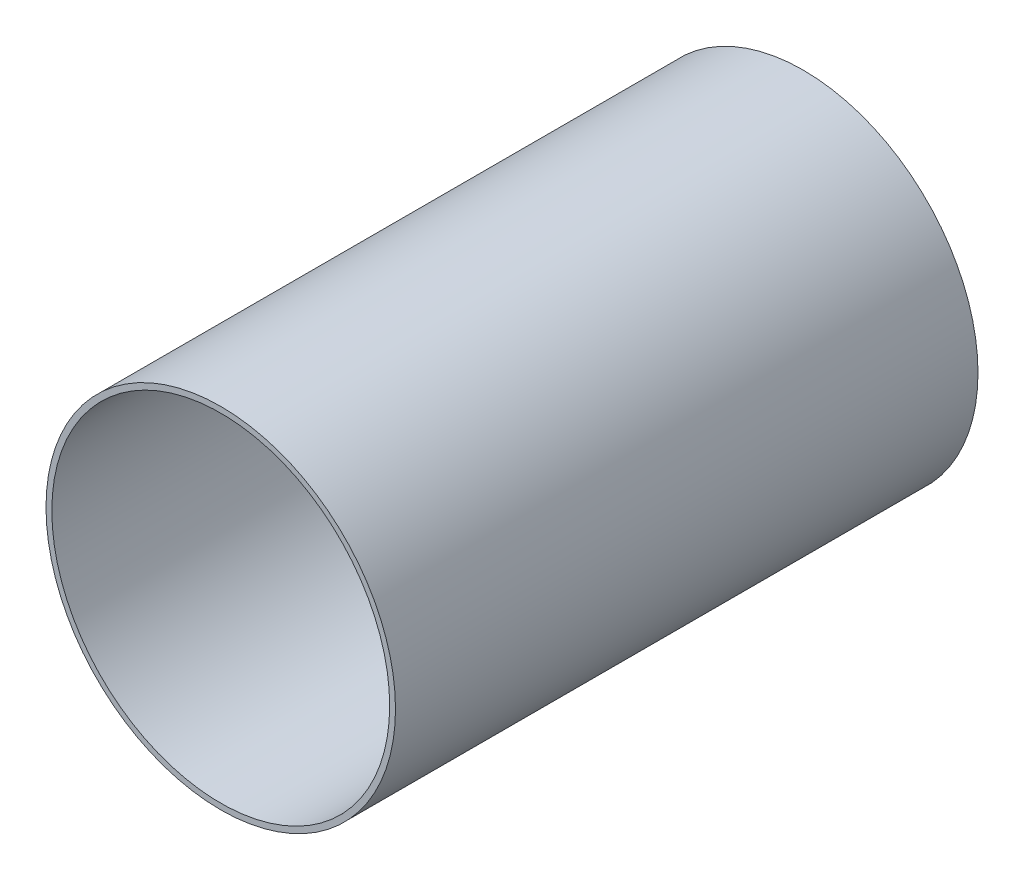
ISO-10303-21;
HEADER;
FILE_DESCRIPTION(('STEP AP214'),'2;1');
FILE_NAME('part.step','',(''),(''),'','','');
FILE_SCHEMA(('AUTOMOTIVE_DESIGN { 1 0 10303 214 1 1 1 1 }'));
ENDSEC;
DATA;
#1=APPLICATION_CONTEXT('core data for automotive mechanical design processes');
#2=APPLICATION_PROTOCOL_DEFINITION('international standard','automotive_design',2000,#1);
#3=PRODUCT_CONTEXT('',#1,'mechanical');
#4=PRODUCT('Part','Part','',(#3));
#5=PRODUCT_RELATED_PRODUCT_CATEGORY('part','',(#4));
#6=PRODUCT_DEFINITION_FORMATION('','',#4);
#7=PRODUCT_DEFINITION_CONTEXT('part definition',#1,'design');
#8=PRODUCT_DEFINITION('design','',#6,#7);
#9=PRODUCT_DEFINITION_SHAPE('','',#8);
#10=(LENGTH_UNIT() NAMED_UNIT(*) SI_UNIT(.MILLI.,.METRE.));
#11=(NAMED_UNIT(*) PLANE_ANGLE_UNIT() SI_UNIT($,.RADIAN.));
#12=(NAMED_UNIT(*) SI_UNIT($,.STERADIAN.) SOLID_ANGLE_UNIT());
#13=UNCERTAINTY_MEASURE_WITH_UNIT(LENGTH_MEASURE(1.E-05),#10,'distance_accuracy_value','');
#14=(GEOMETRIC_REPRESENTATION_CONTEXT(3) GLOBAL_UNCERTAINTY_ASSIGNED_CONTEXT((#13)) GLOBAL_UNIT_ASSIGNED_CONTEXT((#10,
#11,#12)) REPRESENTATION_CONTEXT('',''));
#15=CARTESIAN_POINT('',(0.,0.,0.));
#16=DIRECTION('',(0.,0.,1.));
#17=DIRECTION('',(1.,0.,0.));
#18=AXIS2_PLACEMENT_3D('',#15,#16,#17);
#19=CARTESIAN_POINT('',(0.,0.,5.));
#20=DIRECTION('',(0.,0.,1.));
#21=DIRECTION('',(1.,0.,0.));
#22=AXIS2_PLACEMENT_3D('',#19,#20,#21);
#23=PLANE('',#22);
#24=CARTESIAN_POINT('',(0.,0.,5.));
#25=DIRECTION('',(0.,0.,1.));
#26=DIRECTION('',(1.,0.,0.));
#27=AXIS2_PLACEMENT_3D('',#24,#25,#26);
#28=CIRCLE('',#27,1.5);
#29=CARTESIAN_POINT('',(1.5,0.,5.));
#30=VERTEX_POINT('',#29);
#31=EDGE_CURVE('E10',#30,#30,#28,.T.);
#32=ORIENTED_EDGE('',*,*,#31,.T.);
#33=EDGE_LOOP('',(#32));
#34=FACE_BOUND('',#33,.T.);
#35=CARTESIAN_POINT('',(0.,0.,5.));
#36=DIRECTION('',(0.,0.,1.));
#37=DIRECTION('',(1.,0.,0.));
#38=AXIS2_PLACEMENT_3D('',#35,#36,#37);
#39=CIRCLE('',#38,1.45);
#40=CARTESIAN_POINT('',(1.45,0.,5.));
#41=VERTEX_POINT('',#40);
#42=EDGE_CURVE('E42',#41,#41,#39,.T.);
#43=ORIENTED_EDGE('',*,*,#42,.F.);
#44=EDGE_LOOP('',(#43));
#45=FACE_BOUND('',#44,.T.);
#46=ADVANCED_FACE('F31',(#34,#45),#23,.T.);
#47=CARTESIAN_POINT('',(0.,0.,0.));
#48=DIRECTION('',(0.,0.,1.));
#49=DIRECTION('',(1.,0.,0.));
#50=AXIS2_PLACEMENT_3D('',#47,#48,#49);
#51=PLANE('',#50);
#52=CARTESIAN_POINT('',(0.,0.,0.));
#53=DIRECTION('',(0.,0.,1.));
#54=DIRECTION('',(1.,0.,0.));
#55=AXIS2_PLACEMENT_3D('',#52,#53,#54);
#56=CIRCLE('',#55,1.5);
#57=CARTESIAN_POINT('',(1.5,0.,0.));
#58=VERTEX_POINT('',#57);
#59=EDGE_CURVE('E35',#58,#58,#56,.T.);
#60=ORIENTED_EDGE('',*,*,#59,.F.);
#61=EDGE_LOOP('',(#60));
#62=FACE_BOUND('',#61,.T.);
#63=CARTESIAN_POINT('',(0.,0.,0.));
#64=DIRECTION('',(0.,0.,1.));
#65=DIRECTION('',(1.,0.,0.));
#66=AXIS2_PLACEMENT_3D('',#63,#64,#65);
#67=CIRCLE('',#66,1.45);
#68=CARTESIAN_POINT('',(1.45,0.,0.));
#69=VERTEX_POINT('',#68);
#70=EDGE_CURVE('E44',#69,#69,#67,.T.);
#71=ORIENTED_EDGE('',*,*,#70,.T.);
#72=EDGE_LOOP('',(#71));
#73=FACE_BOUND('',#72,.T.);
#74=ADVANCED_FACE('F54',(#62,#73),#51,.F.);
#75=CARTESIAN_POINT('',(0.,0.,5.));
#76=DIRECTION('',(0.,0.,-1.));
#77=DIRECTION('',(-1.,0.,0.));
#78=AXIS2_PLACEMENT_3D('',#75,#76,#77);
#79=CYLINDRICAL_SURFACE('',#78,1.5);
#80=ORIENTED_EDGE('',*,*,#31,.F.);
#81=EDGE_LOOP('',(#80));
#82=FACE_BOUND('',#81,.T.);
#83=ORIENTED_EDGE('',*,*,#59,.T.);
#84=EDGE_LOOP('',(#83));
#85=FACE_BOUND('',#84,.T.);
#86=ADVANCED_FACE('F33',(#82,#85),#79,.T.);
#87=CARTESIAN_POINT('',(0.,0.,5.));
#88=DIRECTION('',(0.,0.,-1.));
#89=DIRECTION('',(-1.,0.,0.));
#90=AXIS2_PLACEMENT_3D('',#87,#88,#89);
#91=CYLINDRICAL_SURFACE('',#90,1.45);
#92=ORIENTED_EDGE('',*,*,#42,.T.);
#93=EDGE_LOOP('',(#92));
#94=FACE_BOUND('',#93,.T.);
#95=ORIENTED_EDGE('',*,*,#70,.F.);
#96=EDGE_LOOP('',(#95));
#97=FACE_BOUND('',#96,.T.);
#98=ADVANCED_FACE('F50',(#94,#97),#91,.F.);
#99=CLOSED_SHELL('',(#46,#74,#86,#98));
#100=MANIFOLD_SOLID_BREP('B2',#99);
#101=ADVANCED_BREP_SHAPE_REPRESENTATION('',(#18,#100),#14);
#102=SHAPE_DEFINITION_REPRESENTATION(#9,#101);
ENDSEC;
END-ISO-10303-21;
